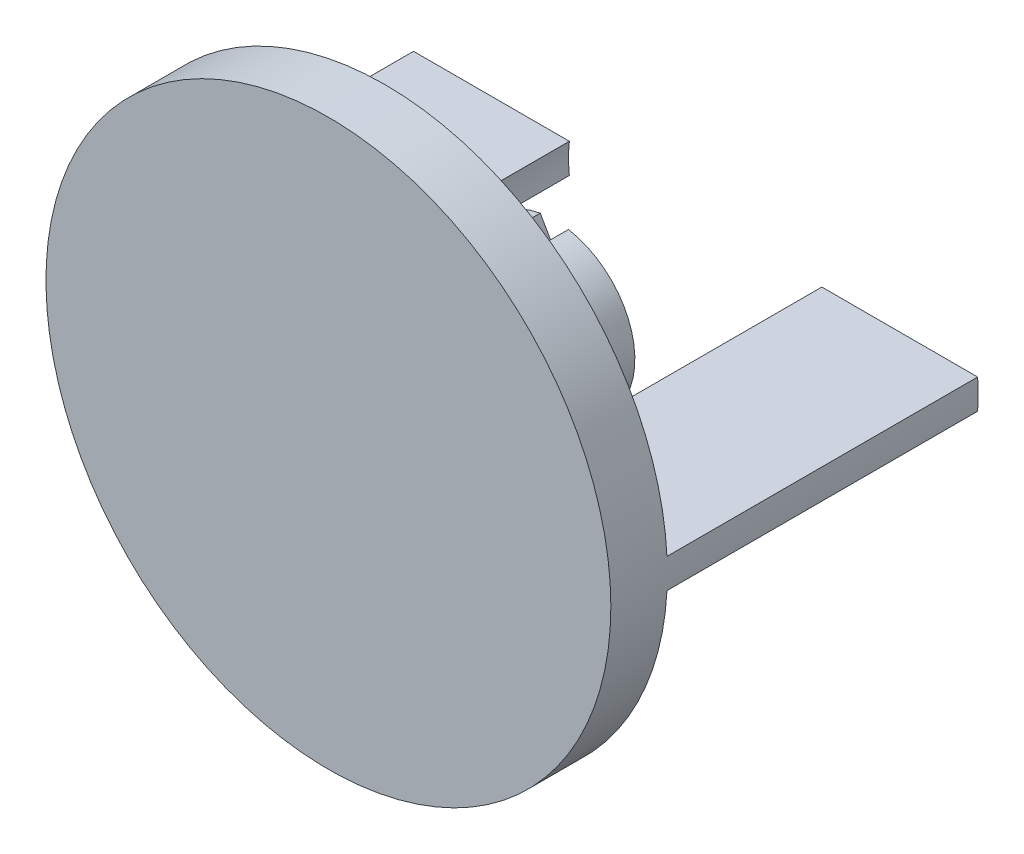
ISO-10303-21;
HEADER;
FILE_DESCRIPTION(('STEP AP214'),'2;1');
FILE_NAME('part.step','',(''),(''),'','','');
FILE_SCHEMA(('AUTOMOTIVE_DESIGN { 1 0 10303 214 1 1 1 1 }'));
ENDSEC;
DATA;
#1=APPLICATION_CONTEXT('core data for automotive mechanical design processes');
#2=APPLICATION_PROTOCOL_DEFINITION('international standard','automotive_design',2000,#1);
#3=PRODUCT_CONTEXT('',#1,'mechanical');
#4=PRODUCT('Part','Part','',(#3));
#5=PRODUCT_RELATED_PRODUCT_CATEGORY('part','',(#4));
#6=PRODUCT_DEFINITION_FORMATION('','',#4);
#7=PRODUCT_DEFINITION_CONTEXT('part definition',#1,'design');
#8=PRODUCT_DEFINITION('design','',#6,#7);
#9=PRODUCT_DEFINITION_SHAPE('','',#8);
#10=(LENGTH_UNIT() NAMED_UNIT(*) SI_UNIT(.MILLI.,.METRE.));
#11=(NAMED_UNIT(*) PLANE_ANGLE_UNIT() SI_UNIT($,.RADIAN.));
#12=(NAMED_UNIT(*) SI_UNIT($,.STERADIAN.) SOLID_ANGLE_UNIT());
#13=UNCERTAINTY_MEASURE_WITH_UNIT(LENGTH_MEASURE(1.E-05),#10,'distance_accuracy_value','');
#14=(GEOMETRIC_REPRESENTATION_CONTEXT(3) GLOBAL_UNCERTAINTY_ASSIGNED_CONTEXT((#13)) GLOBAL_UNIT_ASSIGNED_CONTEXT((#10,
#11,#12)) REPRESENTATION_CONTEXT('',''));
#15=CARTESIAN_POINT('',(0.,0.,0.));
#16=DIRECTION('',(0.,0.,1.));
#17=DIRECTION('',(1.,0.,0.));
#18=AXIS2_PLACEMENT_3D('',#15,#16,#17);
#19=CARTESIAN_POINT('',(0.,0.,0.));
#20=DIRECTION('',(0.,0.,1.));
#21=DIRECTION('',(1.,0.,0.));
#22=AXIS2_PLACEMENT_3D('',#19,#20,#21);
#23=PLANE('',#22);
#24=DIRECTION('',(1.,0.,0.));
#25=VECTOR('',#24,1.);
#26=CARTESIAN_POINT('',(9.98620924074796,0.525,0.));
#27=LINE('',#26,#25);
#28=CARTESIAN_POINT('',(2.80122740954746,0.525,0.));
#29=VERTEX_POINT('',#28);
#30=CARTESIAN_POINT('',(4.46927007463187,0.525,0.));
#31=VERTEX_POINT('',#30);
#32=EDGE_CURVE('E66',#29,#31,#27,.T.);
#33=ORIENTED_EDGE('',*,*,#32,.T.);
#34=CARTESIAN_POINT('',(0.,0.,0.));
#35=DIRECTION('',(0.,0.,-1.));
#36=DIRECTION('',(-1.,0.,0.));
#37=AXIS2_PLACEMENT_3D('',#34,#35,#36);
#38=CIRCLE('',#37,4.5);
#39=CARTESIAN_POINT('',(4.46927007463187,-0.525,0.));
#40=VERTEX_POINT('',#39);
#41=EDGE_CURVE('E160',#31,#40,#38,.T.);
#42=ORIENTED_EDGE('',*,*,#41,.T.);
#43=DIRECTION('',(-1.,0.,0.));
#44=VECTOR('',#43,1.);
#45=CARTESIAN_POINT('',(9.98620924074796,-0.525,0.));
#46=LINE('',#45,#44);
#47=CARTESIAN_POINT('',(2.80122740954746,-0.525,0.));
#48=VERTEX_POINT('',#47);
#49=EDGE_CURVE('E223',#40,#48,#46,.T.);
#50=ORIENTED_EDGE('',*,*,#49,.T.);
#51=CARTESIAN_POINT('',(0.,0.,0.));
#52=DIRECTION('',(0.,0.,-1.));
#53=DIRECTION('',(-1.,0.,0.));
#54=AXIS2_PLACEMENT_3D('',#51,#52,#53);
#55=CIRCLE('',#54,2.85);
#56=EDGE_CURVE('E11',#29,#48,#55,.T.);
#57=ORIENTED_EDGE('',*,*,#56,.F.);
#58=EDGE_LOOP('',(#33,#42,#50,#57));
#59=FACE_BOUND('',#58,.T.);
#60=ADVANCED_FACE('F41',(#59),#23,.F.);
#61=CARTESIAN_POINT('',(-2.80122740954746,-0.525,0.));
#62=VERTEX_POINT('',#61);
#63=CARTESIAN_POINT('',(-4.46927007463187,-0.525,0.));
#64=VERTEX_POINT('',#63);
#65=EDGE_CURVE('E58',#62,#64,#46,.T.);
#66=ORIENTED_EDGE('',*,*,#65,.T.);
#67=CARTESIAN_POINT('',(0.,0.,0.));
#68=DIRECTION('',(0.,0.,-1.));
#69=DIRECTION('',(-1.,0.,0.));
#70=AXIS2_PLACEMENT_3D('',#67,#68,#69);
#71=CIRCLE('',#70,4.5);
#72=CARTESIAN_POINT('',(-4.46927007463187,0.525000000000001,0.));
#73=VERTEX_POINT('',#72);
#74=EDGE_CURVE('E158',#64,#73,#71,.T.);
#75=ORIENTED_EDGE('',*,*,#74,.T.);
#76=CARTESIAN_POINT('',(-2.80122740954746,0.525,0.));
#77=VERTEX_POINT('',#76);
#78=EDGE_CURVE('E225',#73,#77,#27,.T.);
#79=ORIENTED_EDGE('',*,*,#78,.T.);
#80=EDGE_CURVE('E50',#62,#77,#55,.T.);
#81=ORIENTED_EDGE('',*,*,#80,.F.);
#82=EDGE_LOOP('',(#66,#75,#79,#81));
#83=FACE_BOUND('',#82,.T.);
#84=ADVANCED_FACE('F311',(#83),#23,.F.);
#85=CARTESIAN_POINT('',(0.,0.,1.));
#86=DIRECTION('',(0.,0.,-1.));
#87=DIRECTION('',(-1.,0.,0.));
#88=AXIS2_PLACEMENT_3D('',#85,#86,#87);
#89=CYLINDRICAL_SURFACE('',#88,2.85);
#90=DIRECTION('',(0.,0.,-1.));
#91=VECTOR('',#90,1.);
#92=CARTESIAN_POINT('',(2.80122740954746,0.525,1.));
#93=LINE('',#92,#91);
#94=CARTESIAN_POINT('',(2.80122740954746,0.525,1.));
#95=VERTEX_POINT('',#94);
#96=EDGE_CURVE('E242',#29,#95,#93,.F.);
#97=ORIENTED_EDGE('',*,*,#96,.F.);
#98=ORIENTED_EDGE('',*,*,#56,.T.);
#99=DIRECTION('',(0.,0.,-1.));
#100=VECTOR('',#99,1.);
#101=CARTESIAN_POINT('',(2.80122740954746,-0.525,1.));
#102=LINE('',#101,#100);
#103=CARTESIAN_POINT('',(2.80122740954746,-0.525,1.));
#104=VERTEX_POINT('',#103);
#105=EDGE_CURVE('E251',#104,#48,#102,.T.);
#106=ORIENTED_EDGE('',*,*,#105,.F.);
#107=CARTESIAN_POINT('',(0.,0.,1.));
#108=DIRECTION('',(0.,0.,1.));
#109=DIRECTION('',(1.,0.,0.));
#110=AXIS2_PLACEMENT_3D('',#107,#108,#109);
#111=CIRCLE('',#110,2.85);
#112=CARTESIAN_POINT('',(-2.80122740954746,-0.525,1.));
#113=VERTEX_POINT('',#112);
#114=EDGE_CURVE('E258',#113,#104,#111,.T.);
#115=ORIENTED_EDGE('',*,*,#114,.F.);
#116=DIRECTION('',(0.,0.,-1.));
#117=VECTOR('',#116,1.);
#118=CARTESIAN_POINT('',(-2.80122740954746,-0.525,1.));
#119=LINE('',#118,#117);
#120=EDGE_CURVE('E248',#62,#113,#119,.F.);
#121=ORIENTED_EDGE('',*,*,#120,.F.);
#122=ORIENTED_EDGE('',*,*,#80,.T.);
#123=DIRECTION('',(0.,0.,-1.));
#124=VECTOR('',#123,1.);
#125=CARTESIAN_POINT('',(-2.80122740954746,0.525,1.));
#126=LINE('',#125,#124);
#127=CARTESIAN_POINT('',(-2.80122740954747,0.525,1.));
#128=VERTEX_POINT('',#127);
#129=EDGE_CURVE('E245',#128,#77,#126,.T.);
#130=ORIENTED_EDGE('',*,*,#129,.F.);
#131=CARTESIAN_POINT('',(-0.499999999999997,2.80579756931964,1.));
#132=VERTEX_POINT('',#131);
#133=EDGE_CURVE('E265',#132,#128,#111,.T.);
#134=ORIENTED_EDGE('',*,*,#133,.F.);
#135=DIRECTION('',(0.,0.,-1.));
#136=VECTOR('',#135,1.);
#137=CARTESIAN_POINT('',(-0.499999999999997,2.80579756931964,2.35222583566299));
#138=LINE('',#137,#136);
#139=CARTESIAN_POINT('',(-0.499999999999997,2.80579756931964,-5.));
#140=VERTEX_POINT('',#139);
#141=EDGE_CURVE('E213',#132,#140,#138,.T.);
#142=ORIENTED_EDGE('',*,*,#141,.T.);
#143=CARTESIAN_POINT('',(0.,0.,-5.));
#144=DIRECTION('',(0.,0.,-1.));
#145=DIRECTION('',(-1.,0.,0.));
#146=AXIS2_PLACEMENT_3D('',#143,#144,#145);
#147=CIRCLE('',#146,2.85);
#148=CARTESIAN_POINT('',(0.499999999999998,2.80579756931964,-5.));
#149=VERTEX_POINT('',#148);
#150=EDGE_CURVE('E201',#149,#140,#147,.T.);
#151=ORIENTED_EDGE('',*,*,#150,.F.);
#152=DIRECTION('',(0.,0.,-1.));
#153=VECTOR('',#152,1.);
#154=CARTESIAN_POINT('',(0.499999999999998,2.80579756931964,2.35222583566299));
#155=LINE('',#154,#153);
#156=CARTESIAN_POINT('',(0.499999999999998,2.80579756931964,1.));
#157=VERTEX_POINT('',#156);
#158=EDGE_CURVE('E218',#157,#149,#155,.T.);
#159=ORIENTED_EDGE('',*,*,#158,.F.);
#160=EDGE_CURVE('E262',#95,#157,#111,.T.);
#161=ORIENTED_EDGE('',*,*,#160,.F.);
#162=EDGE_LOOP('',(#97,#98,#106,#115,#121,#122,#130,#134,#142,#151,#159,#161));
#163=FACE_BOUND('',#162,.T.);
#164=ADVANCED_FACE('F43',(#163),#89,.T.);
#165=CARTESIAN_POINT('',(0.,0.,1.));
#166=DIRECTION('',(0.,0.,1.));
#167=DIRECTION('',(1.,0.,0.));
#168=AXIS2_PLACEMENT_3D('',#165,#166,#167);
#169=PLANE('',#168);
#170=DIRECTION('',(-1.,0.,0.));
#171=VECTOR('',#170,1.);
#172=CARTESIAN_POINT('',(9.98620924074796,-0.525,1.));
#173=LINE('',#172,#171);
#174=CARTESIAN_POINT('',(9.98620924074796,-0.525,1.));
#175=VERTEX_POINT('',#174);
#176=EDGE_CURVE('E222',#175,#104,#173,.T.);
#177=ORIENTED_EDGE('',*,*,#176,.F.);
#178=CARTESIAN_POINT('',(0.,0.,1.));
#179=DIRECTION('',(0.,0.,1.));
#180=DIRECTION('',(1.,0.,0.));
#181=AXIS2_PLACEMENT_3D('',#178,#179,#180);
#182=CIRCLE('',#181,10.);
#183=CARTESIAN_POINT('',(-9.98620924074796,-0.525,1.));
#184=VERTEX_POINT('',#183);
#185=EDGE_CURVE('E254',#184,#175,#182,.T.);
#186=ORIENTED_EDGE('',*,*,#185,.F.);
#187=DIRECTION('',(-1.,0.,0.));
#188=VECTOR('',#187,1.);
#189=CARTESIAN_POINT('',(0.,-0.525,1.));
#190=LINE('',#189,#188);
#191=EDGE_CURVE('E45',#113,#184,#190,.T.);
#192=ORIENTED_EDGE('',*,*,#191,.F.);
#193=ORIENTED_EDGE('',*,*,#114,.T.);
#194=EDGE_LOOP('',(#177,#186,#192,#193));
#195=FACE_BOUND('',#194,.T.);
#196=ADVANCED_FACE('F306',(#195),#169,.F.);
#197=DIRECTION('',(1.,0.,0.));
#198=VECTOR('',#197,1.);
#199=CARTESIAN_POINT('',(9.98620924074796,0.525,1.));
#200=LINE('',#199,#198);
#201=CARTESIAN_POINT('',(-9.98620924074796,0.525,1.));
#202=VERTEX_POINT('',#201);
#203=EDGE_CURVE('E230',#202,#128,#200,.T.);
#204=ORIENTED_EDGE('',*,*,#203,.F.);
#205=CARTESIAN_POINT('',(9.98620924074796,0.525,1.));
#206=VERTEX_POINT('',#205);
#207=EDGE_CURVE('E259',#206,#202,#182,.T.);
#208=ORIENTED_EDGE('',*,*,#207,.F.);
#209=DIRECTION('',(1.,0.,0.));
#210=VECTOR('',#209,1.);
#211=CARTESIAN_POINT('',(0.,0.525,1.));
#212=LINE('',#211,#210);
#213=EDGE_CURVE('E264',#95,#206,#212,.T.);
#214=ORIENTED_EDGE('',*,*,#213,.F.);
#215=ORIENTED_EDGE('',*,*,#160,.T.);
#216=DIRECTION('',(-0.499999999999998,-0.86602540378444,0.));
#217=VECTOR('',#216,1.);
#218=CARTESIAN_POINT('',(-0.839945986453717,0.484943041383797,1.));
#219=LINE('',#218,#217);
#220=CARTESIAN_POINT('',(0.,1.9397721655352,1.));
#221=VERTEX_POINT('',#220);
#222=EDGE_CURVE('E214',#157,#221,#219,.T.);
#223=ORIENTED_EDGE('',*,*,#222,.T.);
#224=DIRECTION('',(-0.499999999999998,0.86602540378444,0.));
#225=VECTOR('',#224,1.);
#226=CARTESIAN_POINT('',(0.839945986453716,0.484943041383796,1.));
#227=LINE('',#226,#225);
#228=EDGE_CURVE('E209',#221,#132,#227,.T.);
#229=ORIENTED_EDGE('',*,*,#228,.T.);
#230=ORIENTED_EDGE('',*,*,#133,.T.);
#231=EDGE_LOOP('',(#204,#208,#214,#215,#223,#229,#230));
#232=FACE_BOUND('',#231,.T.);
#233=ADVANCED_FACE('F278',(#232),#169,.F.);
#234=CARTESIAN_POINT('',(0.,0.,3.));
#235=DIRECTION('',(0.,0.,-1.));
#236=DIRECTION('',(-1.,0.,0.));
#237=AXIS2_PLACEMENT_3D('',#234,#235,#236);
#238=CYLINDRICAL_SURFACE('',#237,10.);
#239=CARTESIAN_POINT('',(0.,0.,3.));
#240=DIRECTION('',(0.,0.,1.));
#241=DIRECTION('',(1.,0.,0.));
#242=AXIS2_PLACEMENT_3D('',#239,#240,#241);
#243=CIRCLE('',#242,10.);
#244=CARTESIAN_POINT('',(10.,0.,3.));
#245=VERTEX_POINT('',#244);
#246=EDGE_CURVE('E255',#245,#245,#243,.T.);
#247=ORIENTED_EDGE('',*,*,#246,.F.);
#248=EDGE_LOOP('',(#247));
#249=FACE_BOUND('',#248,.T.);
#250=ORIENTED_EDGE('',*,*,#207,.T.);
#251=DIRECTION('',(0.,0.,1.));
#252=VECTOR('',#251,1.);
#253=CARTESIAN_POINT('',(-9.98620924074796,0.525000000000003,0.));
#254=LINE('',#253,#252);
#255=CARTESIAN_POINT('',(-9.98620924074796,0.525000000000003,-10.));
#256=VERTEX_POINT('',#255);
#257=EDGE_CURVE('E235',#256,#202,#254,.T.);
#258=ORIENTED_EDGE('',*,*,#257,.F.);
#259=CARTESIAN_POINT('',(0.,0.,-10.));
#260=DIRECTION('',(0.,0.,-1.));
#261=DIRECTION('',(-1.,0.,0.));
#262=AXIS2_PLACEMENT_3D('',#259,#260,#261);
#263=CIRCLE('',#262,10.);
#264=CARTESIAN_POINT('',(-9.98620924074796,-0.525000000000006,-10.));
#265=VERTEX_POINT('',#264);
#266=EDGE_CURVE('E172',#265,#256,#263,.T.);
#267=ORIENTED_EDGE('',*,*,#266,.F.);
#268=DIRECTION('',(0.,0.,1.));
#269=VECTOR('',#268,1.);
#270=CARTESIAN_POINT('',(-9.98620924074796,-0.525,0.));
#271=LINE('',#270,#269);
#272=EDGE_CURVE('E168',#265,#184,#271,.T.);
#273=ORIENTED_EDGE('',*,*,#272,.T.);
#274=ORIENTED_EDGE('',*,*,#185,.T.);
#275=DIRECTION('',(0.,0.,1.));
#276=VECTOR('',#275,1.);
#277=CARTESIAN_POINT('',(9.98620924074796,-0.525,0.));
#278=LINE('',#277,#276);
#279=CARTESIAN_POINT('',(9.98620924074796,-0.525,-10.));
#280=VERTEX_POINT('',#279);
#281=EDGE_CURVE('E239',#280,#175,#278,.T.);
#282=ORIENTED_EDGE('',*,*,#281,.F.);
#283=CARTESIAN_POINT('',(0.,0.,-10.));
#284=DIRECTION('',(0.,0.,-1.));
#285=DIRECTION('',(-1.,0.,0.));
#286=AXIS2_PLACEMENT_3D('',#283,#284,#285);
#287=CIRCLE('',#286,10.);
#288=CARTESIAN_POINT('',(9.98620924074796,0.525,-10.));
#289=VERTEX_POINT('',#288);
#290=EDGE_CURVE('E190',#289,#280,#287,.T.);
#291=ORIENTED_EDGE('',*,*,#290,.F.);
#292=DIRECTION('',(0.,0.,1.));
#293=VECTOR('',#292,1.);
#294=CARTESIAN_POINT('',(9.98620924074796,0.525,0.));
#295=LINE('',#294,#293);
#296=EDGE_CURVE('E227',#289,#206,#295,.T.);
#297=ORIENTED_EDGE('',*,*,#296,.T.);
#298=EDGE_LOOP('',(#250,#258,#267,#273,#274,#282,#291,#297));
#299=FACE_BOUND('',#298,.T.);
#300=ADVANCED_FACE('F280',(#249,#299),#238,.T.);
#301=CARTESIAN_POINT('',(0.,0.,3.));
#302=DIRECTION('',(0.,0.,1.));
#303=DIRECTION('',(1.,0.,0.));
#304=AXIS2_PLACEMENT_3D('',#301,#302,#303);
#305=PLANE('',#304);
#306=ORIENTED_EDGE('',*,*,#246,.T.);
#307=EDGE_LOOP('',(#306));
#308=FACE_BOUND('',#307,.T.);
#309=ADVANCED_FACE('F319',(#308),#305,.T.);
#310=CARTESIAN_POINT('',(9.98620924074796,0.525,0.));
#311=DIRECTION('',(0.,-1.,0.));
#312=DIRECTION('',(0.,0.,-1.));
#313=AXIS2_PLACEMENT_3D('',#310,#311,#312);
#314=PLANE('',#313);
#315=ORIENTED_EDGE('',*,*,#32,.F.);
#316=ORIENTED_EDGE('',*,*,#96,.T.);
#317=ORIENTED_EDGE('',*,*,#213,.T.);
#318=ORIENTED_EDGE('',*,*,#296,.F.);
#319=DIRECTION('',(1.,0.,0.));
#320=VECTOR('',#319,1.);
#321=CARTESIAN_POINT('',(0.,0.525,-10.));
#322=LINE('',#321,#320);
#323=CARTESIAN_POINT('',(4.46927007463187,0.525,-10.));
#324=VERTEX_POINT('',#323);
#325=EDGE_CURVE('E187',#324,#289,#322,.T.);
#326=ORIENTED_EDGE('',*,*,#325,.F.);
#327=DIRECTION('',(0.,0.,1.));
#328=VECTOR('',#327,1.);
#329=CARTESIAN_POINT('',(4.46927007463187,0.525,-10.));
#330=LINE('',#329,#328);
#331=EDGE_CURVE('E199',#324,#31,#330,.T.);
#332=ORIENTED_EDGE('',*,*,#331,.T.);
#333=EDGE_LOOP('',(#315,#316,#317,#318,#326,#332));
#334=FACE_BOUND('',#333,.T.);
#335=ADVANCED_FACE('F283',(#334),#314,.F.);
#336=CARTESIAN_POINT('',(9.98620924074796,-0.525,0.));
#337=DIRECTION('',(0.,1.,0.));
#338=DIRECTION('',(0.,0.,1.));
#339=AXIS2_PLACEMENT_3D('',#336,#337,#338);
#340=PLANE('',#339);
#341=ORIENTED_EDGE('',*,*,#176,.T.);
#342=ORIENTED_EDGE('',*,*,#105,.T.);
#343=ORIENTED_EDGE('',*,*,#49,.F.);
#344=DIRECTION('',(0.,0.,1.));
#345=VECTOR('',#344,1.);
#346=CARTESIAN_POINT('',(4.46927007463187,-0.525,-10.));
#347=LINE('',#346,#345);
#348=CARTESIAN_POINT('',(4.46927007463187,-0.525,-10.));
#349=VERTEX_POINT('',#348);
#350=EDGE_CURVE('E195',#349,#40,#347,.T.);
#351=ORIENTED_EDGE('',*,*,#350,.F.);
#352=DIRECTION('',(-1.,0.,0.));
#353=VECTOR('',#352,1.);
#354=CARTESIAN_POINT('',(0.,-0.525,-10.));
#355=LINE('',#354,#353);
#356=EDGE_CURVE('E193',#280,#349,#355,.T.);
#357=ORIENTED_EDGE('',*,*,#356,.F.);
#358=ORIENTED_EDGE('',*,*,#281,.T.);
#359=EDGE_LOOP('',(#341,#342,#343,#351,#357,#358));
#360=FACE_BOUND('',#359,.T.);
#361=ADVANCED_FACE('F309',(#360),#340,.F.);
#362=ORIENTED_EDGE('',*,*,#65,.F.);
#363=ORIENTED_EDGE('',*,*,#120,.T.);
#364=ORIENTED_EDGE('',*,*,#191,.T.);
#365=ORIENTED_EDGE('',*,*,#272,.F.);
#366=DIRECTION('',(-1.,0.,0.));
#367=VECTOR('',#366,1.);
#368=CARTESIAN_POINT('',(0.,-0.524999999999995,-10.));
#369=LINE('',#368,#367);
#370=CARTESIAN_POINT('',(-4.46927007463187,-0.525,-10.));
#371=VERTEX_POINT('',#370);
#372=EDGE_CURVE('E164',#371,#265,#369,.T.);
#373=ORIENTED_EDGE('',*,*,#372,.F.);
#374=DIRECTION('',(0.,0.,1.));
#375=VECTOR('',#374,1.);
#376=CARTESIAN_POINT('',(-4.46927007463187,-0.525,-10.));
#377=LINE('',#376,#375);
#378=EDGE_CURVE('E152',#371,#64,#377,.T.);
#379=ORIENTED_EDGE('',*,*,#378,.T.);
#380=EDGE_LOOP('',(#362,#363,#364,#365,#373,#379));
#381=FACE_BOUND('',#380,.T.);
#382=ADVANCED_FACE('F165',(#381),#340,.F.);
#383=ORIENTED_EDGE('',*,*,#203,.T.);
#384=ORIENTED_EDGE('',*,*,#129,.T.);
#385=ORIENTED_EDGE('',*,*,#78,.F.);
#386=DIRECTION('',(0.,0.,1.));
#387=VECTOR('',#386,1.);
#388=CARTESIAN_POINT('',(-4.46927007463187,0.525000000000001,-10.));
#389=LINE('',#388,#387);
#390=CARTESIAN_POINT('',(-4.46927007463187,0.525000000000001,-10.));
#391=VERTEX_POINT('',#390);
#392=EDGE_CURVE('E161',#391,#73,#389,.T.);
#393=ORIENTED_EDGE('',*,*,#392,.F.);
#394=DIRECTION('',(1.,0.,0.));
#395=VECTOR('',#394,1.);
#396=CARTESIAN_POINT('',(0.,0.524999999999999,-10.));
#397=LINE('',#396,#395);
#398=EDGE_CURVE('E176',#256,#391,#397,.T.);
#399=ORIENTED_EDGE('',*,*,#398,.F.);
#400=ORIENTED_EDGE('',*,*,#257,.T.);
#401=EDGE_LOOP('',(#383,#384,#385,#393,#399,#400));
#402=FACE_BOUND('',#401,.T.);
#403=ADVANCED_FACE('F276',(#402),#314,.F.);
#404=CARTESIAN_POINT('',(0.839945986453716,0.484943041383796,2.35222583566299));
#405=DIRECTION('',(-0.86602540378444,-0.499999999999998,0.));
#406=DIRECTION('',(0.499999999999998,-0.86602540378444,0.));
#407=AXIS2_PLACEMENT_3D('',#404,#405,#406);
#408=PLANE('',#407);
#409=DIRECTION('',(0.,0.,-1.));
#410=VECTOR('',#409,1.);
#411=CARTESIAN_POINT('',(0.,1.9397721655352,2.35222583566299));
#412=LINE('',#411,#410);
#413=CARTESIAN_POINT('',(0.,1.9397721655352,-5.));
#414=VERTEX_POINT('',#413);
#415=EDGE_CURVE('E217',#221,#414,#412,.T.);
#416=ORIENTED_EDGE('',*,*,#415,.T.);
#417=DIRECTION('',(0.499999999999998,-0.86602540378444,0.));
#418=VECTOR('',#417,1.);
#419=CARTESIAN_POINT('',(-0.499999999999997,2.80579756931964,-5.));
#420=LINE('',#419,#418);
#421=EDGE_CURVE('E204',#140,#414,#420,.T.);
#422=ORIENTED_EDGE('',*,*,#421,.F.);
#423=ORIENTED_EDGE('',*,*,#141,.F.);
#424=ORIENTED_EDGE('',*,*,#228,.F.);
#425=EDGE_LOOP('',(#416,#422,#423,#424));
#426=FACE_BOUND('',#425,.T.);
#427=ADVANCED_FACE('F301',(#426),#408,.F.);
#428=CARTESIAN_POINT('',(-0.839945986453717,0.484943041383797,2.35222583566299));
#429=DIRECTION('',(0.86602540378444,-0.499999999999998,0.));
#430=DIRECTION('',(0.499999999999998,0.86602540378444,0.));
#431=AXIS2_PLACEMENT_3D('',#428,#429,#430);
#432=PLANE('',#431);
#433=ORIENTED_EDGE('',*,*,#158,.T.);
#434=DIRECTION('',(0.499999999999998,0.86602540378444,0.));
#435=VECTOR('',#434,1.);
#436=CARTESIAN_POINT('',(0.,1.9397721655352,-5.));
#437=LINE('',#436,#435);
#438=EDGE_CURVE('E207',#414,#149,#437,.T.);
#439=ORIENTED_EDGE('',*,*,#438,.F.);
#440=ORIENTED_EDGE('',*,*,#415,.F.);
#441=ORIENTED_EDGE('',*,*,#222,.F.);
#442=EDGE_LOOP('',(#433,#439,#440,#441));
#443=FACE_BOUND('',#442,.T.);
#444=ADVANCED_FACE('F298',(#443),#432,.F.);
#445=CARTESIAN_POINT('',(0.,0.,-5.));
#446=DIRECTION('',(0.,0.,-1.));
#447=DIRECTION('',(-1.,0.,0.));
#448=AXIS2_PLACEMENT_3D('',#445,#446,#447);
#449=PLANE('',#448);
#450=ORIENTED_EDGE('',*,*,#150,.T.);
#451=ORIENTED_EDGE('',*,*,#421,.T.);
#452=ORIENTED_EDGE('',*,*,#438,.T.);
#453=EDGE_LOOP('',(#450,#451,#452));
#454=FACE_BOUND('',#453,.T.);
#455=ADVANCED_FACE('F303',(#454),#449,.T.);
#456=CARTESIAN_POINT('',(0.,0.,-10.));
#457=DIRECTION('',(0.,0.,1.));
#458=DIRECTION('',(1.,0.,0.));
#459=AXIS2_PLACEMENT_3D('',#456,#457,#458);
#460=CYLINDRICAL_SURFACE('',#459,4.5);
#461=ORIENTED_EDGE('',*,*,#41,.F.);
#462=ORIENTED_EDGE('',*,*,#331,.F.);
#463=CARTESIAN_POINT('',(0.,0.,-10.));
#464=DIRECTION('',(0.,0.,-1.));
#465=DIRECTION('',(-1.,0.,0.));
#466=AXIS2_PLACEMENT_3D('',#463,#464,#465);
#467=CIRCLE('',#466,4.5);
#468=EDGE_CURVE('E184',#324,#349,#467,.T.);
#469=ORIENTED_EDGE('',*,*,#468,.T.);
#470=ORIENTED_EDGE('',*,*,#350,.T.);
#471=EDGE_LOOP('',(#461,#462,#469,#470));
#472=FACE_BOUND('',#471,.T.);
#473=ADVANCED_FACE('F291',(#472),#460,.F.);
#474=CARTESIAN_POINT('',(0.,0.,-10.));
#475=DIRECTION('',(0.,0.,-1.));
#476=DIRECTION('',(-1.,0.,0.));
#477=AXIS2_PLACEMENT_3D('',#474,#475,#476);
#478=PLANE('',#477);
#479=ORIENTED_EDGE('',*,*,#468,.F.);
#480=ORIENTED_EDGE('',*,*,#325,.T.);
#481=ORIENTED_EDGE('',*,*,#290,.T.);
#482=ORIENTED_EDGE('',*,*,#356,.T.);
#483=EDGE_LOOP('',(#479,#480,#481,#482));
#484=FACE_BOUND('',#483,.T.);
#485=ADVANCED_FACE('F286',(#484),#478,.T.);
#486=CARTESIAN_POINT('',(0.,0.,-10.));
#487=DIRECTION('',(0.,0.,1.));
#488=DIRECTION('',(1.,0.,0.));
#489=AXIS2_PLACEMENT_3D('',#486,#487,#488);
#490=CYLINDRICAL_SURFACE('',#489,4.5);
#491=ORIENTED_EDGE('',*,*,#74,.F.);
#492=ORIENTED_EDGE('',*,*,#378,.F.);
#493=CARTESIAN_POINT('',(0.,0.,-10.));
#494=DIRECTION('',(0.,0.,-1.));
#495=DIRECTION('',(-1.,0.,0.));
#496=AXIS2_PLACEMENT_3D('',#493,#494,#495);
#497=CIRCLE('',#496,4.5);
#498=EDGE_CURVE('E157',#371,#391,#497,.T.);
#499=ORIENTED_EDGE('',*,*,#498,.T.);
#500=ORIENTED_EDGE('',*,*,#392,.T.);
#501=EDGE_LOOP('',(#491,#492,#499,#500));
#502=FACE_BOUND('',#501,.T.);
#503=ADVANCED_FACE('F154',(#502),#490,.F.);
#504=CARTESIAN_POINT('',(0.,0.,-10.));
#505=DIRECTION('',(0.,0.,-1.));
#506=DIRECTION('',(-1.,0.,0.));
#507=AXIS2_PLACEMENT_3D('',#504,#505,#506);
#508=PLANE('',#507);
#509=ORIENTED_EDGE('',*,*,#498,.F.);
#510=ORIENTED_EDGE('',*,*,#372,.T.);
#511=ORIENTED_EDGE('',*,*,#266,.T.);
#512=ORIENTED_EDGE('',*,*,#398,.T.);
#513=EDGE_LOOP('',(#509,#510,#511,#512));
#514=FACE_BOUND('',#513,.T.);
#515=ADVANCED_FACE('F174',(#514),#508,.T.);
#516=CLOSED_SHELL('',(#60,#84,#164,#196,#233,#300,#309,#335,#361,#382,#403,#427,#444,#455,#473,
#485,#503,#515));
#517=MANIFOLD_SOLID_BREP('B2',#516);
#518=ADVANCED_BREP_SHAPE_REPRESENTATION('',(#18,#517),#14);
#519=SHAPE_DEFINITION_REPRESENTATION(#9,#518);
ENDSEC;
END-ISO-10303-21;
